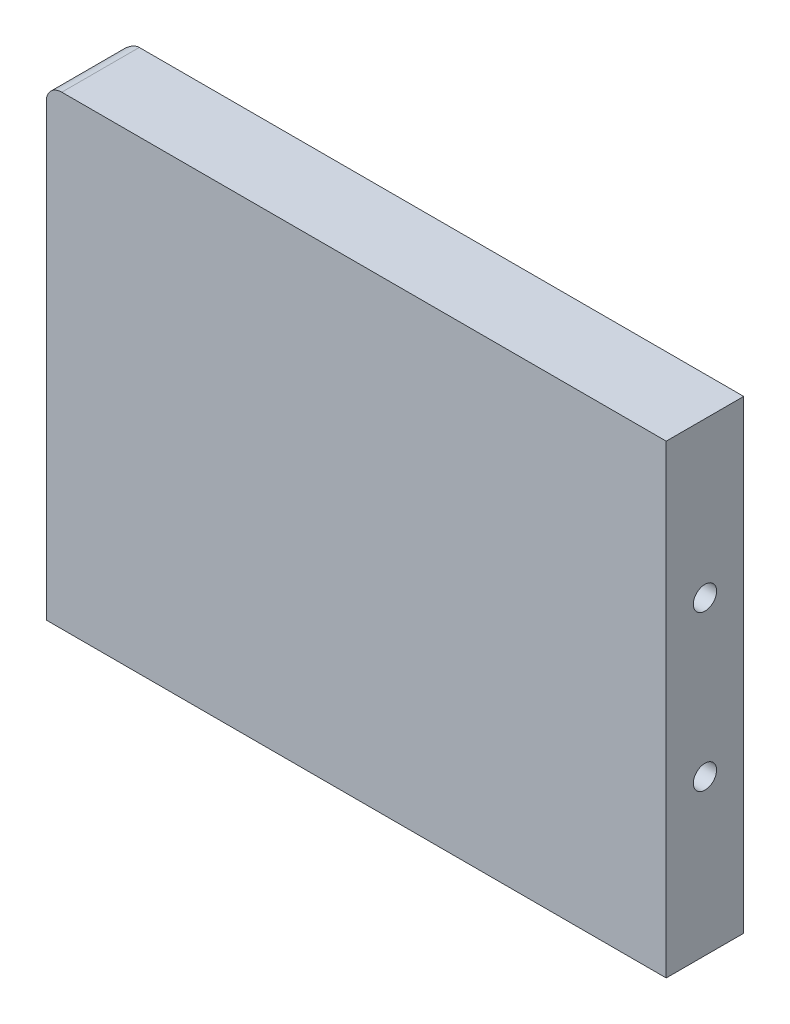
ISO-10303-21;
HEADER;
FILE_DESCRIPTION(('STEP AP214'),'2;1');
FILE_NAME('part.step','',(''),(''),'','','');
FILE_SCHEMA(('AUTOMOTIVE_DESIGN { 1 0 10303 214 1 1 1 1 }'));
ENDSEC;
DATA;
#1=APPLICATION_CONTEXT('core data for automotive mechanical design processes');
#2=APPLICATION_PROTOCOL_DEFINITION('international standard','automotive_design',2000,#1);
#3=PRODUCT_CONTEXT('',#1,'mechanical');
#4=PRODUCT('Part','Part','',(#3));
#5=PRODUCT_RELATED_PRODUCT_CATEGORY('part','',(#4));
#6=PRODUCT_DEFINITION_FORMATION('','',#4);
#7=PRODUCT_DEFINITION_CONTEXT('part definition',#1,'design');
#8=PRODUCT_DEFINITION('design','',#6,#7);
#9=PRODUCT_DEFINITION_SHAPE('','',#8);
#10=(LENGTH_UNIT() NAMED_UNIT(*) SI_UNIT(.MILLI.,.METRE.));
#11=(NAMED_UNIT(*) PLANE_ANGLE_UNIT() SI_UNIT($,.RADIAN.));
#12=(NAMED_UNIT(*) SI_UNIT($,.STERADIAN.) SOLID_ANGLE_UNIT());
#13=UNCERTAINTY_MEASURE_WITH_UNIT(LENGTH_MEASURE(1.E-05),#10,'distance_accuracy_value','');
#14=(GEOMETRIC_REPRESENTATION_CONTEXT(3) GLOBAL_UNCERTAINTY_ASSIGNED_CONTEXT((#13)) GLOBAL_UNIT_ASSIGNED_CONTEXT((#10,
#11,#12)) REPRESENTATION_CONTEXT('',''));
#15=CARTESIAN_POINT('',(0.,0.,0.));
#16=DIRECTION('',(0.,0.,1.));
#17=DIRECTION('',(1.,0.,0.));
#18=AXIS2_PLACEMENT_3D('',#15,#16,#17);
#19=CARTESIAN_POINT('',(80.,0.,-105.));
#20=DIRECTION('',(0.,0.,-1.));
#21=DIRECTION('',(0.,1.,0.));
#22=AXIS2_PLACEMENT_3D('',#19,#20,#21);
#23=PLANE('',#22);
#24=DIRECTION('',(-1.,0.,0.));
#25=VECTOR('',#24,1.);
#26=CARTESIAN_POINT('',(40.,70.,-105.));
#27=LINE('',#26,#25);
#28=CARTESIAN_POINT('',(40.,70.,-105.));
#29=VERTEX_POINT('',#28);
#30=CARTESIAN_POINT('',(1.,70.,-105.));
#31=VERTEX_POINT('',#30);
#32=EDGE_CURVE('E112',#29,#31,#27,.T.);
#33=ORIENTED_EDGE('',*,*,#32,.T.);
#34=DIRECTION('',(0.,-1.,0.));
#35=VECTOR('',#34,1.);
#36=CARTESIAN_POINT('',(1.,100.,-105.));
#37=LINE('',#36,#35);
#38=CARTESIAN_POINT('',(1.,100.,-105.));
#39=VERTEX_POINT('',#38);
#40=EDGE_CURVE('E148',#31,#39,#37,.F.);
#41=ORIENTED_EDGE('',*,*,#40,.T.);
#42=DIRECTION('',(-1.,0.,0.));
#43=VECTOR('',#42,1.);
#44=CARTESIAN_POINT('',(80.,100.,-105.));
#45=LINE('',#44,#43);
#46=CARTESIAN_POINT('',(40.,100.,-105.));
#47=VERTEX_POINT('',#46);
#48=EDGE_CURVE('E121',#47,#39,#45,.T.);
#49=ORIENTED_EDGE('',*,*,#48,.F.);
#50=DIRECTION('',(0.,-1.,0.));
#51=VECTOR('',#50,1.);
#52=CARTESIAN_POINT('',(40.,100.,-105.));
#53=LINE('',#52,#51);
#54=EDGE_CURVE('E105',#47,#29,#53,.T.);
#55=ORIENTED_EDGE('',*,*,#54,.T.);
#56=EDGE_LOOP('',(#33,#41,#49,#55));
#57=FACE_BOUND('',#56,.T.);
#58=ADVANCED_FACE('F50',(#57),#23,.T.);
#59=CARTESIAN_POINT('',(80.,100.,-2.7755575615629E-13));
#60=DIRECTION('',(0.,1.,0.));
#61=DIRECTION('',(0.,0.,1.));
#62=AXIS2_PLACEMENT_3D('',#59,#60,#61);
#63=PLANE('',#62);
#64=DIRECTION('',(0.,0.,1.));
#65=VECTOR('',#64,1.);
#66=CARTESIAN_POINT('',(40.,100.,-105.));
#67=LINE('',#66,#65);
#68=CARTESIAN_POINT('',(40.,100.,-100.));
#69=VERTEX_POINT('',#68);
#70=EDGE_CURVE('E109',#47,#69,#67,.T.);
#71=ORIENTED_EDGE('',*,*,#70,.F.);
#72=ORIENTED_EDGE('',*,*,#48,.T.);
#73=DIRECTION('',(0.,0.,-1.));
#74=VECTOR('',#73,1.);
#75=CARTESIAN_POINT('',(1.,100.,-100.));
#76=LINE('',#75,#74);
#77=CARTESIAN_POINT('',(1.,100.,-100.));
#78=VERTEX_POINT('',#77);
#79=EDGE_CURVE('E151',#39,#78,#76,.F.);
#80=ORIENTED_EDGE('',*,*,#79,.T.);
#81=DIRECTION('',(-1.,0.,0.));
#82=VECTOR('',#81,1.);
#83=CARTESIAN_POINT('',(80.,100.,-100.));
#84=LINE('',#83,#82);
#85=EDGE_CURVE('E74',#69,#78,#84,.T.);
#86=ORIENTED_EDGE('',*,*,#85,.F.);
#87=EDGE_LOOP('',(#71,#72,#80,#86));
#88=FACE_BOUND('',#87,.T.);
#89=ADVANCED_FACE('F169',(#88),#63,.T.);
#90=CARTESIAN_POINT('',(80.,0.,-100.));
#91=DIRECTION('',(0.,0.,1.));
#92=DIRECTION('',(1.,0.,0.));
#93=AXIS2_PLACEMENT_3D('',#90,#91,#92);
#94=PLANE('',#93);
#95=DIRECTION('',(-1.,0.,0.));
#96=VECTOR('',#95,1.);
#97=CARTESIAN_POINT('',(80.,70.,-100.));
#98=LINE('',#97,#96);
#99=CARTESIAN_POINT('',(40.,70.,-100.));
#100=VERTEX_POINT('',#99);
#101=CARTESIAN_POINT('',(0.,70.,-100.));
#102=VERTEX_POINT('',#101);
#103=EDGE_CURVE('E130',#100,#102,#98,.T.);
#104=ORIENTED_EDGE('',*,*,#103,.F.);
#105=DIRECTION('',(0.,-1.,0.));
#106=VECTOR('',#105,1.);
#107=CARTESIAN_POINT('',(40.,0.,-100.));
#108=LINE('',#107,#106);
#109=EDGE_CURVE('E12',#69,#100,#108,.T.);
#110=ORIENTED_EDGE('',*,*,#109,.F.);
#111=ORIENTED_EDGE('',*,*,#85,.T.);
#112=CARTESIAN_POINT('',(1.,99.,-100.));
#113=DIRECTION('',(0.,0.,1.));
#114=DIRECTION('',(1.,0.,0.));
#115=AXIS2_PLACEMENT_3D('',#112,#113,#114);
#116=CIRCLE('',#115,1.);
#117=CARTESIAN_POINT('',(0.,99.,-100.));
#118=VERTEX_POINT('',#117);
#119=EDGE_CURVE('E154',#78,#118,#116,.T.);
#120=ORIENTED_EDGE('',*,*,#119,.T.);
#121=DIRECTION('',(0.,1.,0.));
#122=VECTOR('',#121,1.);
#123=CARTESIAN_POINT('',(0.,0.,-100.));
#124=LINE('',#123,#122);
#125=EDGE_CURVE('E134',#102,#118,#124,.T.);
#126=ORIENTED_EDGE('',*,*,#125,.F.);
#127=EDGE_LOOP('',(#104,#110,#111,#120,#126));
#128=FACE_BOUND('',#127,.T.);
#129=ADVANCED_FACE('F170',(#128),#94,.T.);
#130=CARTESIAN_POINT('',(0.,0.,0.));
#131=DIRECTION('',(1.,0.,0.));
#132=DIRECTION('',(0.,0.,-1.));
#133=AXIS2_PLACEMENT_3D('',#130,#131,#132);
#134=PLANE('',#133);
#135=DIRECTION('',(0.,-1.,0.));
#136=VECTOR('',#135,1.);
#137=CARTESIAN_POINT('',(0.,-4.99999999999999,-104.));
#138=LINE('',#137,#136);
#139=CARTESIAN_POINT('',(0.,99.,-104.));
#140=VERTEX_POINT('',#139);
#141=CARTESIAN_POINT('',(0.,70.,-104.));
#142=VERTEX_POINT('',#141);
#143=EDGE_CURVE('E144',#140,#142,#138,.T.);
#144=ORIENTED_EDGE('',*,*,#143,.T.);
#145=DIRECTION('',(0.,0.,1.));
#146=VECTOR('',#145,1.);
#147=CARTESIAN_POINT('',(0.,70.,-105.));
#148=LINE('',#147,#146);
#149=EDGE_CURVE('E66',#142,#102,#148,.T.);
#150=ORIENTED_EDGE('',*,*,#149,.T.);
#151=ORIENTED_EDGE('',*,*,#125,.T.);
#152=DIRECTION('',(0.,0.,-1.));
#153=VECTOR('',#152,1.);
#154=CARTESIAN_POINT('',(0.,99.,-105.));
#155=LINE('',#154,#153);
#156=EDGE_CURVE('E141',#118,#140,#155,.T.);
#157=ORIENTED_EDGE('',*,*,#156,.T.);
#158=EDGE_LOOP('',(#144,#150,#151,#157));
#159=FACE_BOUND('',#158,.T.);
#160=ADVANCED_FACE('F173',(#159),#134,.F.);
#161=CARTESIAN_POINT('',(1.,99.0000000000003,-2.74780198594727E-13));
#162=DIRECTION('',(0.,0.,1.));
#163=DIRECTION('',(0.,-1.,0.));
#164=AXIS2_PLACEMENT_3D('',#161,#162,#163);
#165=CYLINDRICAL_SURFACE('',#164,1.);
#166=ORIENTED_EDGE('',*,*,#119,.F.);
#167=ORIENTED_EDGE('',*,*,#79,.F.);
#168=CARTESIAN_POINT('',(1.,99.,-104.));
#169=DIRECTION('',(0.,0.707106781186548,0.707106781186547));
#170=DIRECTION('',(0.,-0.707106781186547,0.707106781186548));
#171=AXIS2_PLACEMENT_3D('',#168,#169,#170);
#172=ELLIPSE('',#171,1.41421356237309,1.);
#173=EDGE_CURVE('E133',#140,#39,#172,.F.);
#174=ORIENTED_EDGE('',*,*,#173,.F.);
#175=ORIENTED_EDGE('',*,*,#156,.F.);
#176=EDGE_LOOP('',(#166,#167,#174,#175));
#177=FACE_BOUND('',#176,.T.);
#178=ADVANCED_FACE('F52',(#177),#165,.T.);
#179=CARTESIAN_POINT('',(1.,0.,-104.));
#180=DIRECTION('',(0.,1.,0.));
#181=DIRECTION('',(0.,0.,1.));
#182=AXIS2_PLACEMENT_3D('',#179,#180,#181);
#183=CYLINDRICAL_SURFACE('',#182,1.);
#184=CARTESIAN_POINT('',(1.,70.,-104.));
#185=DIRECTION('',(0.,1.,0.));
#186=DIRECTION('',(0.,0.,1.));
#187=AXIS2_PLACEMENT_3D('',#184,#185,#186);
#188=CIRCLE('',#187,1.);
#189=EDGE_CURVE('E59',#142,#31,#188,.F.);
#190=ORIENTED_EDGE('',*,*,#189,.F.);
#191=ORIENTED_EDGE('',*,*,#143,.F.);
#192=ORIENTED_EDGE('',*,*,#173,.T.);
#193=ORIENTED_EDGE('',*,*,#40,.F.);
#194=EDGE_LOOP('',(#190,#191,#192,#193));
#195=FACE_BOUND('',#194,.T.);
#196=ADVANCED_FACE('F163',(#195),#183,.T.);
#197=CARTESIAN_POINT('',(40.,70.,-105.));
#198=DIRECTION('',(0.,1.,0.));
#199=DIRECTION('',(0.,0.,1.));
#200=AXIS2_PLACEMENT_3D('',#197,#198,#199);
#201=PLANE('',#200);
#202=CARTESIAN_POINT('',(30.,70.,-102.5));
#203=DIRECTION('',(0.,-1.,0.));
#204=DIRECTION('',(0.,0.,-1.));
#205=AXIS2_PLACEMENT_3D('',#202,#203,#204);
#206=CIRCLE('',#205,0.750000000000002);
#207=CARTESIAN_POINT('',(30.,70.,-103.25));
#208=VERTEX_POINT('',#207);
#209=EDGE_CURVE('E239',#208,#208,#206,.T.);
#210=ORIENTED_EDGE('',*,*,#209,.F.);
#211=EDGE_LOOP('',(#210));
#212=FACE_BOUND('',#211,.T.);
#213=CARTESIAN_POINT('',(10.,70.,-102.5));
#214=DIRECTION('',(0.,-1.,0.));
#215=DIRECTION('',(0.,0.,-1.));
#216=AXIS2_PLACEMENT_3D('',#213,#214,#215);
#217=CIRCLE('',#216,0.75);
#218=CARTESIAN_POINT('',(10.,70.,-103.25));
#219=VERTEX_POINT('',#218);
#220=EDGE_CURVE('E252',#219,#219,#217,.T.);
#221=ORIENTED_EDGE('',*,*,#220,.F.);
#222=EDGE_LOOP('',(#221));
#223=FACE_BOUND('',#222,.T.);
#224=ORIENTED_EDGE('',*,*,#103,.T.);
#225=ORIENTED_EDGE('',*,*,#149,.F.);
#226=ORIENTED_EDGE('',*,*,#189,.T.);
#227=ORIENTED_EDGE('',*,*,#32,.F.);
#228=DIRECTION('',(0.,0.,1.));
#229=VECTOR('',#228,1.);
#230=CARTESIAN_POINT('',(40.,70.,-105.));
#231=LINE('',#230,#229);
#232=EDGE_CURVE('E101',#29,#100,#231,.T.);
#233=ORIENTED_EDGE('',*,*,#232,.T.);
#234=EDGE_LOOP('',(#224,#225,#226,#227,#233));
#235=FACE_BOUND('',#234,.T.);
#236=ADVANCED_FACE('F113',(#212,#223,#235),#201,.F.);
#237=CARTESIAN_POINT('',(40.,100.,-105.));
#238=DIRECTION('',(-1.,0.,0.));
#239=DIRECTION('',(0.,-1.,0.));
#240=AXIS2_PLACEMENT_3D('',#237,#238,#239);
#241=PLANE('',#240);
#242=CARTESIAN_POINT('',(40.,80.0000000000001,-102.5));
#243=DIRECTION('',(1.,0.,0.));
#244=DIRECTION('',(0.,1.,0.));
#245=AXIS2_PLACEMENT_3D('',#242,#243,#244);
#246=CIRCLE('',#245,0.749999999999999);
#247=CARTESIAN_POINT('',(40.,80.7500000000001,-102.5));
#248=VERTEX_POINT('',#247);
#249=EDGE_CURVE('E259',#248,#248,#246,.T.);
#250=ORIENTED_EDGE('',*,*,#249,.F.);
#251=EDGE_LOOP('',(#250));
#252=FACE_BOUND('',#251,.T.);
#253=CARTESIAN_POINT('',(40.,90.0000000000001,-102.5));
#254=DIRECTION('',(1.,0.,0.));
#255=DIRECTION('',(0.,1.,0.));
#256=AXIS2_PLACEMENT_3D('',#253,#254,#255);
#257=CIRCLE('',#256,0.749999999999999);
#258=CARTESIAN_POINT('',(40.,90.7500000000001,-102.5));
#259=VERTEX_POINT('',#258);
#260=EDGE_CURVE('E244',#259,#259,#257,.T.);
#261=ORIENTED_EDGE('',*,*,#260,.F.);
#262=EDGE_LOOP('',(#261));
#263=FACE_BOUND('',#262,.T.);
#264=ORIENTED_EDGE('',*,*,#109,.T.);
#265=ORIENTED_EDGE('',*,*,#232,.F.);
#266=ORIENTED_EDGE('',*,*,#54,.F.);
#267=ORIENTED_EDGE('',*,*,#70,.T.);
#268=EDGE_LOOP('',(#264,#265,#266,#267));
#269=FACE_BOUND('',#268,.T.);
#270=ADVANCED_FACE('F103',(#252,#263,#269),#241,.F.);
#271=CARTESIAN_POINT('',(35.,90.0000000000001,-102.5));
#272=DIRECTION('',(1.,0.,0.));
#273=DIRECTION('',(0.,1.,0.));
#274=AXIS2_PLACEMENT_3D('',#271,#272,#273);
#275=CYLINDRICAL_SURFACE('',#274,0.749999999999999);
#276=ORIENTED_EDGE('',*,*,#260,.T.);
#277=EDGE_LOOP('',(#276));
#278=FACE_BOUND('',#277,.T.);
#279=CARTESIAN_POINT('',(35.,90.0000000000001,-102.5));
#280=DIRECTION('',(1.,0.,0.));
#281=DIRECTION('',(0.,1.,0.));
#282=AXIS2_PLACEMENT_3D('',#279,#280,#281);
#283=CIRCLE('',#282,0.749999999999999);
#284=CARTESIAN_POINT('',(35.,90.7500000000001,-102.5));
#285=VERTEX_POINT('',#284);
#286=EDGE_CURVE('E238',#285,#285,#283,.T.);
#287=ORIENTED_EDGE('',*,*,#286,.F.);
#288=EDGE_LOOP('',(#287));
#289=FACE_BOUND('',#288,.T.);
#290=ADVANCED_FACE('F196',(#278,#289),#275,.F.);
#291=CARTESIAN_POINT('',(35.,0.,0.));
#292=DIRECTION('',(1.,0.,0.));
#293=DIRECTION('',(0.,1.,0.));
#294=AXIS2_PLACEMENT_3D('',#291,#292,#293);
#295=PLANE('',#294);
#296=ORIENTED_EDGE('',*,*,#286,.T.);
#297=EDGE_LOOP('',(#296));
#298=FACE_BOUND('',#297,.T.);
#299=ADVANCED_FACE('F202',(#298),#295,.T.);
#300=CARTESIAN_POINT('',(35.,80.0000000000001,-102.5));
#301=DIRECTION('',(1.,0.,0.));
#302=DIRECTION('',(0.,1.,0.));
#303=AXIS2_PLACEMENT_3D('',#300,#301,#302);
#304=CYLINDRICAL_SURFACE('',#303,0.749999999999999);
#305=CARTESIAN_POINT('',(35.,80.0000000000001,-102.5));
#306=DIRECTION('',(1.,0.,0.));
#307=DIRECTION('',(0.,1.,0.));
#308=AXIS2_PLACEMENT_3D('',#305,#306,#307);
#309=CIRCLE('',#308,0.749999999999999);
#310=CARTESIAN_POINT('',(35.,80.7500000000001,-102.5));
#311=VERTEX_POINT('',#310);
#312=EDGE_CURVE('E118',#311,#311,#309,.T.);
#313=ORIENTED_EDGE('',*,*,#312,.F.);
#314=EDGE_LOOP('',(#313));
#315=FACE_BOUND('',#314,.T.);
#316=ORIENTED_EDGE('',*,*,#249,.T.);
#317=EDGE_LOOP('',(#316));
#318=FACE_BOUND('',#317,.T.);
#319=ADVANCED_FACE('F205',(#315,#318),#304,.F.);
#320=CARTESIAN_POINT('',(35.,80.0000000000001,-102.5));
#321=DIRECTION('',(1.,0.,0.));
#322=DIRECTION('',(0.,1.,0.));
#323=AXIS2_PLACEMENT_3D('',#320,#321,#322);
#324=PLANE('',#323);
#325=ORIENTED_EDGE('',*,*,#312,.T.);
#326=EDGE_LOOP('',(#325));
#327=FACE_BOUND('',#326,.T.);
#328=ADVANCED_FACE('F212',(#327),#324,.T.);
#329=CARTESIAN_POINT('',(10.,75.,-102.5));
#330=DIRECTION('',(0.,-1.,0.));
#331=DIRECTION('',(0.,0.,-1.));
#332=AXIS2_PLACEMENT_3D('',#329,#330,#331);
#333=CYLINDRICAL_SURFACE('',#332,0.75);
#334=CARTESIAN_POINT('',(10.,75.,-102.5));
#335=DIRECTION('',(0.,-1.,0.));
#336=DIRECTION('',(0.,0.,-1.));
#337=AXIS2_PLACEMENT_3D('',#334,#335,#336);
#338=CIRCLE('',#337,0.75);
#339=CARTESIAN_POINT('',(10.,75.,-103.25));
#340=VERTEX_POINT('',#339);
#341=EDGE_CURVE('E246',#340,#340,#338,.T.);
#342=ORIENTED_EDGE('',*,*,#341,.F.);
#343=EDGE_LOOP('',(#342));
#344=FACE_BOUND('',#343,.T.);
#345=ORIENTED_EDGE('',*,*,#220,.T.);
#346=EDGE_LOOP('',(#345));
#347=FACE_BOUND('',#346,.T.);
#348=ADVANCED_FACE('F216',(#344,#347),#333,.F.);
#349=CARTESIAN_POINT('',(0.,75.,0.));
#350=DIRECTION('',(0.,-1.,0.));
#351=DIRECTION('',(0.,0.,-1.));
#352=AXIS2_PLACEMENT_3D('',#349,#350,#351);
#353=PLANE('',#352);
#354=ORIENTED_EDGE('',*,*,#341,.T.);
#355=EDGE_LOOP('',(#354));
#356=FACE_BOUND('',#355,.T.);
#357=ADVANCED_FACE('F220',(#356),#353,.T.);
#358=CARTESIAN_POINT('',(30.,75.,-102.5));
#359=DIRECTION('',(0.,-1.,0.));
#360=DIRECTION('',(0.,0.,-1.));
#361=AXIS2_PLACEMENT_3D('',#358,#359,#360);
#362=CYLINDRICAL_SURFACE('',#361,0.750000000000002);
#363=CARTESIAN_POINT('',(30.,75.,-102.5));
#364=DIRECTION('',(0.,-1.,0.));
#365=DIRECTION('',(0.,0.,-1.));
#366=AXIS2_PLACEMENT_3D('',#363,#364,#365);
#367=CIRCLE('',#366,0.750000000000002);
#368=CARTESIAN_POINT('',(30.,75.,-103.25));
#369=VERTEX_POINT('',#368);
#370=EDGE_CURVE('E236',#369,#369,#367,.T.);
#371=ORIENTED_EDGE('',*,*,#370,.F.);
#372=EDGE_LOOP('',(#371));
#373=FACE_BOUND('',#372,.T.);
#374=ORIENTED_EDGE('',*,*,#209,.T.);
#375=EDGE_LOOP('',(#374));
#376=FACE_BOUND('',#375,.T.);
#377=ADVANCED_FACE('F224',(#373,#376),#362,.F.);
#378=CARTESIAN_POINT('',(0.,75.,0.));
#379=DIRECTION('',(0.,-1.,0.));
#380=DIRECTION('',(0.,0.,-1.));
#381=AXIS2_PLACEMENT_3D('',#378,#379,#380);
#382=PLANE('',#381);
#383=ORIENTED_EDGE('',*,*,#370,.T.);
#384=EDGE_LOOP('',(#383));
#385=FACE_BOUND('',#384,.T.);
#386=ADVANCED_FACE('F228',(#385),#382,.T.);
#387=CLOSED_SHELL('',(#58,#89,#129,#160,#178,#196,#236,#270,#290,#299,#319,#328,#348,#357,#377,#386));
#388=MANIFOLD_SOLID_BREP('B2',#387);
#389=ADVANCED_BREP_SHAPE_REPRESENTATION('',(#18,#388),#14);
#390=SHAPE_DEFINITION_REPRESENTATION(#9,#389);
ENDSEC;
END-ISO-10303-21;
